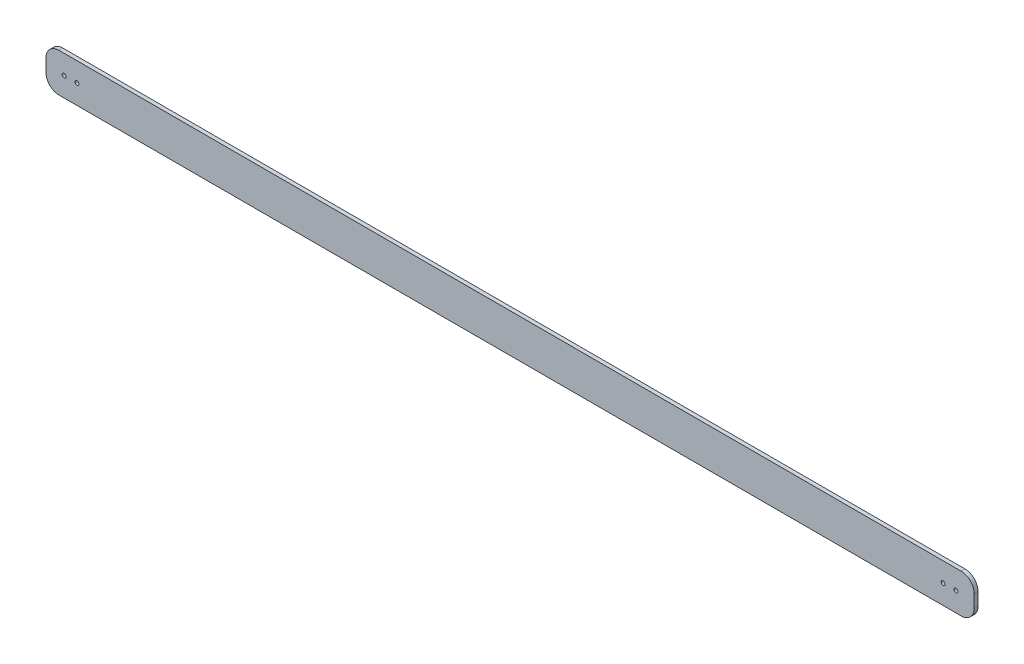
ISO-10303-21;
HEADER;
FILE_DESCRIPTION(('STEP AP214'),'2;1');
FILE_NAME('part.step','',(''),(''),'','','');
FILE_SCHEMA(('AUTOMOTIVE_DESIGN { 1 0 10303 214 1 1 1 1 }'));
ENDSEC;
DATA;
#1=APPLICATION_CONTEXT('core data for automotive mechanical design processes');
#2=APPLICATION_PROTOCOL_DEFINITION('international standard','automotive_design',2000,#1);
#3=PRODUCT_CONTEXT('',#1,'mechanical');
#4=PRODUCT('Part','Part','',(#3));
#5=PRODUCT_RELATED_PRODUCT_CATEGORY('part','',(#4));
#6=PRODUCT_DEFINITION_FORMATION('','',#4);
#7=PRODUCT_DEFINITION_CONTEXT('part definition',#1,'design');
#8=PRODUCT_DEFINITION('design','',#6,#7);
#9=PRODUCT_DEFINITION_SHAPE('','',#8);
#10=(LENGTH_UNIT() NAMED_UNIT(*) SI_UNIT(.MILLI.,.METRE.));
#11=(NAMED_UNIT(*) PLANE_ANGLE_UNIT() SI_UNIT($,.RADIAN.));
#12=(NAMED_UNIT(*) SI_UNIT($,.STERADIAN.) SOLID_ANGLE_UNIT());
#13=UNCERTAINTY_MEASURE_WITH_UNIT(LENGTH_MEASURE(1.E-05),#10,'distance_accuracy_value','');
#14=(GEOMETRIC_REPRESENTATION_CONTEXT(3) GLOBAL_UNCERTAINTY_ASSIGNED_CONTEXT((#13)) GLOBAL_UNIT_ASSIGNED_CONTEXT((#10,
#11,#12)) REPRESENTATION_CONTEXT('',''));
#15=CARTESIAN_POINT('',(0.,0.,0.));
#16=DIRECTION('',(0.,0.,1.));
#17=DIRECTION('',(1.,0.,0.));
#18=AXIS2_PLACEMENT_3D('',#15,#16,#17);
#19=CARTESIAN_POINT('',(401.183077698994,108.864864864865,3.));
#20=DIRECTION('',(0.,0.,1.));
#21=DIRECTION('',(1.,0.,0.));
#22=AXIS2_PLACEMENT_3D('',#19,#20,#21);
#23=PLANE('',#22);
#24=CARTESIAN_POINT('',(387.183077698994,113.864864864865,3.));
#25=DIRECTION('',(0.,0.,1.));
#26=DIRECTION('',(1.,0.,0.));
#27=AXIS2_PLACEMENT_3D('',#24,#25,#26);
#28=CIRCLE('',#27,1.50000000000002);
#29=CARTESIAN_POINT('',(388.683077698994,113.864864864865,3.));
#30=VERTEX_POINT('',#29);
#31=EDGE_CURVE('E190',#30,#30,#28,.T.);
#32=ORIENTED_EDGE('',*,*,#31,.F.);
#33=EDGE_LOOP('',(#32));
#34=FACE_BOUND('',#33,.T.);
#35=CARTESIAN_POINT('',(-292.816922301006,113.864864864865,3.));
#36=DIRECTION('',(0.,0.,1.));
#37=DIRECTION('',(1.,0.,0.));
#38=AXIS2_PLACEMENT_3D('',#35,#36,#37);
#39=CIRCLE('',#38,1.50000000000002);
#40=CARTESIAN_POINT('',(-291.316922301006,113.864864864865,3.));
#41=VERTEX_POINT('',#40);
#42=EDGE_CURVE('E136',#41,#41,#39,.T.);
#43=ORIENTED_EDGE('',*,*,#42,.F.);
#44=EDGE_LOOP('',(#43));
#45=FACE_BOUND('',#44,.T.);
#46=CARTESIAN_POINT('',(401.183077698994,108.864864864865,3.));
#47=DIRECTION('',(0.,0.,1.));
#48=DIRECTION('',(1.,0.,0.));
#49=AXIS2_PLACEMENT_3D('',#46,#47,#48);
#50=CIRCLE('',#49,10.);
#51=CARTESIAN_POINT('',(401.183077698994,98.8648648648649,3.));
#52=VERTEX_POINT('',#51);
#53=CARTESIAN_POINT('',(411.183077698994,108.864864864865,3.));
#54=VERTEX_POINT('',#53);
#55=EDGE_CURVE('E147',#52,#54,#50,.T.);
#56=ORIENTED_EDGE('',*,*,#55,.T.);
#57=DIRECTION('',(0.,1.,0.));
#58=VECTOR('',#57,1.);
#59=CARTESIAN_POINT('',(411.183077698994,118.864864864865,3.));
#60=LINE('',#59,#58);
#61=CARTESIAN_POINT('',(411.183077698994,118.864864864865,3.));
#62=VERTEX_POINT('',#61);
#63=EDGE_CURVE('E95',#54,#62,#60,.T.);
#64=ORIENTED_EDGE('',*,*,#63,.T.);
#65=CARTESIAN_POINT('',(401.183077698994,118.864864864865,3.));
#66=DIRECTION('',(0.,0.,1.));
#67=DIRECTION('',(-1.,0.,0.));
#68=AXIS2_PLACEMENT_3D('',#65,#66,#67);
#69=CIRCLE('',#68,9.99999999999997);
#70=CARTESIAN_POINT('',(401.183077698994,128.864864864865,3.));
#71=VERTEX_POINT('',#70);
#72=EDGE_CURVE('E162',#62,#71,#69,.T.);
#73=ORIENTED_EDGE('',*,*,#72,.T.);
#74=DIRECTION('',(-1.,0.,0.));
#75=VECTOR('',#74,1.);
#76=CARTESIAN_POINT('',(-296.816922301006,128.864864864865,3.));
#77=LINE('',#76,#75);
#78=CARTESIAN_POINT('',(-296.816922301006,128.864864864865,3.));
#79=VERTEX_POINT('',#78);
#80=EDGE_CURVE('E175',#71,#79,#77,.T.);
#81=ORIENTED_EDGE('',*,*,#80,.T.);
#82=CARTESIAN_POINT('',(-296.816922301006,118.864864864865,3.));
#83=DIRECTION('',(0.,0.,1.));
#84=DIRECTION('',(1.,0.,0.));
#85=AXIS2_PLACEMENT_3D('',#82,#83,#84);
#86=CIRCLE('',#85,10.);
#87=CARTESIAN_POINT('',(-306.816922301006,118.864864864865,3.));
#88=VERTEX_POINT('',#87);
#89=EDGE_CURVE('E114',#79,#88,#86,.T.);
#90=ORIENTED_EDGE('',*,*,#89,.T.);
#91=DIRECTION('',(0.,-1.,0.));
#92=VECTOR('',#91,1.);
#93=CARTESIAN_POINT('',(-306.816922301006,118.864864864865,3.));
#94=LINE('',#93,#92);
#95=CARTESIAN_POINT('',(-306.816922301006,108.864864864865,3.));
#96=VERTEX_POINT('',#95);
#97=EDGE_CURVE('E108',#88,#96,#94,.T.);
#98=ORIENTED_EDGE('',*,*,#97,.T.);
#99=CARTESIAN_POINT('',(-296.816922301006,108.864864864865,3.));
#100=DIRECTION('',(0.,0.,1.));
#101=DIRECTION('',(1.,0.,0.));
#102=AXIS2_PLACEMENT_3D('',#99,#100,#101);
#103=CIRCLE('',#102,10.);
#104=CARTESIAN_POINT('',(-296.816922301006,98.8648648648649,3.));
#105=VERTEX_POINT('',#104);
#106=EDGE_CURVE('E112',#96,#105,#103,.T.);
#107=ORIENTED_EDGE('',*,*,#106,.T.);
#108=DIRECTION('',(1.,0.,0.));
#109=VECTOR('',#108,1.);
#110=CARTESIAN_POINT('',(-296.816922301006,98.8648648648649,3.));
#111=LINE('',#110,#109);
#112=EDGE_CURVE('E52',#105,#52,#111,.T.);
#113=ORIENTED_EDGE('',*,*,#112,.T.);
#114=EDGE_LOOP('',(#56,#64,#73,#81,#90,#98,#107,#113));
#115=FACE_BOUND('',#114,.T.);
#116=CARTESIAN_POINT('',(-282.816922301006,113.864864864865,3.));
#117=DIRECTION('',(0.,0.,1.));
#118=DIRECTION('',(1.,0.,0.));
#119=AXIS2_PLACEMENT_3D('',#116,#117,#118);
#120=CIRCLE('',#119,1.50000000000002);
#121=CARTESIAN_POINT('',(-281.316922301006,113.864864864865,3.));
#122=VERTEX_POINT('',#121);
#123=EDGE_CURVE('E184',#122,#122,#120,.T.);
#124=ORIENTED_EDGE('',*,*,#123,.F.);
#125=EDGE_LOOP('',(#124));
#126=FACE_BOUND('',#125,.T.);
#127=CARTESIAN_POINT('',(397.183077698994,113.864864864865,3.));
#128=DIRECTION('',(0.,0.,1.));
#129=DIRECTION('',(1.,0.,0.));
#130=AXIS2_PLACEMENT_3D('',#127,#128,#129);
#131=CIRCLE('',#130,1.50000000000002);
#132=CARTESIAN_POINT('',(398.683077698994,113.864864864865,3.));
#133=VERTEX_POINT('',#132);
#134=EDGE_CURVE('E196',#133,#133,#131,.T.);
#135=ORIENTED_EDGE('',*,*,#134,.F.);
#136=EDGE_LOOP('',(#135));
#137=FACE_BOUND('',#136,.T.);
#138=ADVANCED_FACE('F35',(#34,#45,#115,#126,#137),#23,.T.);
#139=CARTESIAN_POINT('',(401.183077698994,108.864864864865,0.));
#140=DIRECTION('',(0.,0.,1.));
#141=DIRECTION('',(1.,0.,0.));
#142=AXIS2_PLACEMENT_3D('',#139,#140,#141);
#143=PLANE('',#142);
#144=CARTESIAN_POINT('',(401.183077698994,108.864864864865,0.));
#145=DIRECTION('',(0.,0.,1.));
#146=DIRECTION('',(1.,0.,0.));
#147=AXIS2_PLACEMENT_3D('',#144,#145,#146);
#148=CIRCLE('',#147,10.);
#149=CARTESIAN_POINT('',(401.183077698994,98.8648648648649,0.));
#150=VERTEX_POINT('',#149);
#151=CARTESIAN_POINT('',(411.183077698994,108.864864864865,0.));
#152=VERTEX_POINT('',#151);
#153=EDGE_CURVE('E132',#150,#152,#148,.T.);
#154=ORIENTED_EDGE('',*,*,#153,.F.);
#155=DIRECTION('',(1.,0.,0.));
#156=VECTOR('',#155,1.);
#157=CARTESIAN_POINT('',(-296.816922301006,98.8648648648649,0.));
#158=LINE('',#157,#156);
#159=CARTESIAN_POINT('',(-296.816922301006,98.8648648648649,0.));
#160=VERTEX_POINT('',#159);
#161=EDGE_CURVE('E87',#160,#150,#158,.T.);
#162=ORIENTED_EDGE('',*,*,#161,.F.);
#163=CARTESIAN_POINT('',(-296.816922301006,108.864864864865,0.));
#164=DIRECTION('',(0.,0.,1.));
#165=DIRECTION('',(1.,0.,0.));
#166=AXIS2_PLACEMENT_3D('',#163,#164,#165);
#167=CIRCLE('',#166,10.);
#168=CARTESIAN_POINT('',(-306.816922301006,108.864864864865,0.));
#169=VERTEX_POINT('',#168);
#170=EDGE_CURVE('E81',#169,#160,#167,.T.);
#171=ORIENTED_EDGE('',*,*,#170,.F.);
#172=DIRECTION('',(0.,-1.,0.));
#173=VECTOR('',#172,1.);
#174=CARTESIAN_POINT('',(-306.816922301006,118.864864864865,0.));
#175=LINE('',#174,#173);
#176=CARTESIAN_POINT('',(-306.816922301006,118.864864864865,0.));
#177=VERTEX_POINT('',#176);
#178=EDGE_CURVE('E122',#177,#169,#175,.T.);
#179=ORIENTED_EDGE('',*,*,#178,.F.);
#180=CARTESIAN_POINT('',(-296.816922301006,118.864864864865,0.));
#181=DIRECTION('',(0.,0.,1.));
#182=DIRECTION('',(1.,0.,0.));
#183=AXIS2_PLACEMENT_3D('',#180,#181,#182);
#184=CIRCLE('',#183,10.);
#185=CARTESIAN_POINT('',(-296.816922301006,128.864864864865,0.));
#186=VERTEX_POINT('',#185);
#187=EDGE_CURVE('E142',#186,#177,#184,.T.);
#188=ORIENTED_EDGE('',*,*,#187,.F.);
#189=DIRECTION('',(-1.,0.,0.));
#190=VECTOR('',#189,1.);
#191=CARTESIAN_POINT('',(-296.816922301006,128.864864864865,0.));
#192=LINE('',#191,#190);
#193=CARTESIAN_POINT('',(401.183077698994,128.864864864865,0.));
#194=VERTEX_POINT('',#193);
#195=EDGE_CURVE('E140',#194,#186,#192,.T.);
#196=ORIENTED_EDGE('',*,*,#195,.F.);
#197=CARTESIAN_POINT('',(401.183077698994,118.864864864865,0.));
#198=DIRECTION('',(0.,0.,1.));
#199=DIRECTION('',(-1.,0.,0.));
#200=AXIS2_PLACEMENT_3D('',#197,#198,#199);
#201=CIRCLE('',#200,9.99999999999997);
#202=CARTESIAN_POINT('',(411.183077698994,118.864864864865,0.));
#203=VERTEX_POINT('',#202);
#204=EDGE_CURVE('E138',#203,#194,#201,.T.);
#205=ORIENTED_EDGE('',*,*,#204,.F.);
#206=DIRECTION('',(0.,1.,0.));
#207=VECTOR('',#206,1.);
#208=CARTESIAN_POINT('',(411.183077698994,118.864864864865,0.));
#209=LINE('',#208,#207);
#210=EDGE_CURVE('E135',#152,#203,#209,.T.);
#211=ORIENTED_EDGE('',*,*,#210,.F.);
#212=EDGE_LOOP('',(#154,#162,#171,#179,#188,#196,#205,#211));
#213=FACE_BOUND('',#212,.T.);
#214=CARTESIAN_POINT('',(-292.816922301006,113.864864864865,0.));
#215=DIRECTION('',(0.,0.,1.));
#216=DIRECTION('',(1.,0.,0.));
#217=AXIS2_PLACEMENT_3D('',#214,#215,#216);
#218=CIRCLE('',#217,1.50000000000002);
#219=CARTESIAN_POINT('',(-291.316922301006,113.864864864865,0.));
#220=VERTEX_POINT('',#219);
#221=EDGE_CURVE('E181',#220,#220,#218,.T.);
#222=ORIENTED_EDGE('',*,*,#221,.T.);
#223=EDGE_LOOP('',(#222));
#224=FACE_BOUND('',#223,.T.);
#225=CARTESIAN_POINT('',(-282.816922301006,113.864864864865,0.));
#226=DIRECTION('',(0.,0.,1.));
#227=DIRECTION('',(1.,0.,0.));
#228=AXIS2_PLACEMENT_3D('',#225,#226,#227);
#229=CIRCLE('',#228,1.50000000000002);
#230=CARTESIAN_POINT('',(-281.316922301006,113.864864864865,0.));
#231=VERTEX_POINT('',#230);
#232=EDGE_CURVE('E187',#231,#231,#229,.T.);
#233=ORIENTED_EDGE('',*,*,#232,.T.);
#234=EDGE_LOOP('',(#233));
#235=FACE_BOUND('',#234,.T.);
#236=CARTESIAN_POINT('',(387.183077698994,113.864864864865,0.));
#237=DIRECTION('',(0.,0.,1.));
#238=DIRECTION('',(1.,0.,0.));
#239=AXIS2_PLACEMENT_3D('',#236,#237,#238);
#240=CIRCLE('',#239,1.50000000000002);
#241=CARTESIAN_POINT('',(388.683077698994,113.864864864865,0.));
#242=VERTEX_POINT('',#241);
#243=EDGE_CURVE('E193',#242,#242,#240,.T.);
#244=ORIENTED_EDGE('',*,*,#243,.T.);
#245=EDGE_LOOP('',(#244));
#246=FACE_BOUND('',#245,.T.);
#247=CARTESIAN_POINT('',(397.183077698994,113.864864864865,0.));
#248=DIRECTION('',(0.,0.,1.));
#249=DIRECTION('',(1.,0.,0.));
#250=AXIS2_PLACEMENT_3D('',#247,#248,#249);
#251=CIRCLE('',#250,1.50000000000002);
#252=CARTESIAN_POINT('',(398.683077698994,113.864864864865,0.));
#253=VERTEX_POINT('',#252);
#254=EDGE_CURVE('E199',#253,#253,#251,.T.);
#255=ORIENTED_EDGE('',*,*,#254,.T.);
#256=EDGE_LOOP('',(#255));
#257=FACE_BOUND('',#256,.T.);
#258=ADVANCED_FACE('F166',(#213,#224,#235,#246,#257),#143,.F.);
#259=CARTESIAN_POINT('',(401.183077698994,108.864864864865,3.));
#260=DIRECTION('',(0.,0.,-1.));
#261=DIRECTION('',(-1.,0.,0.));
#262=AXIS2_PLACEMENT_3D('',#259,#260,#261);
#263=CYLINDRICAL_SURFACE('',#262,10.);
#264=ORIENTED_EDGE('',*,*,#153,.T.);
#265=DIRECTION('',(0.,0.,-1.));
#266=VECTOR('',#265,1.);
#267=CARTESIAN_POINT('',(411.183077698994,108.864864864865,3.));
#268=LINE('',#267,#266);
#269=EDGE_CURVE('E11',#54,#152,#268,.T.);
#270=ORIENTED_EDGE('',*,*,#269,.F.);
#271=ORIENTED_EDGE('',*,*,#55,.F.);
#272=DIRECTION('',(0.,0.,-1.));
#273=VECTOR('',#272,1.);
#274=CARTESIAN_POINT('',(401.183077698994,98.8648648648649,3.));
#275=LINE('',#274,#273);
#276=EDGE_CURVE('E128',#52,#150,#275,.T.);
#277=ORIENTED_EDGE('',*,*,#276,.T.);
#278=EDGE_LOOP('',(#264,#270,#271,#277));
#279=FACE_BOUND('',#278,.T.);
#280=ADVANCED_FACE('F37',(#279),#263,.T.);
#281=CARTESIAN_POINT('',(411.183077698994,118.864864864865,3.));
#282=DIRECTION('',(-1.,0.,0.));
#283=DIRECTION('',(0.,0.,1.));
#284=AXIS2_PLACEMENT_3D('',#281,#282,#283);
#285=PLANE('',#284);
#286=ORIENTED_EDGE('',*,*,#210,.T.);
#287=DIRECTION('',(0.,0.,-1.));
#288=VECTOR('',#287,1.);
#289=CARTESIAN_POINT('',(411.183077698994,118.864864864865,3.));
#290=LINE('',#289,#288);
#291=EDGE_CURVE('E44',#62,#203,#290,.T.);
#292=ORIENTED_EDGE('',*,*,#291,.F.);
#293=ORIENTED_EDGE('',*,*,#63,.F.);
#294=ORIENTED_EDGE('',*,*,#269,.T.);
#295=EDGE_LOOP('',(#286,#292,#293,#294));
#296=FACE_BOUND('',#295,.T.);
#297=ADVANCED_FACE('F233',(#296),#285,.F.);
#298=CARTESIAN_POINT('',(401.183077698994,118.864864864865,3.));
#299=DIRECTION('',(0.,0.,-1.));
#300=DIRECTION('',(-1.,0.,0.));
#301=AXIS2_PLACEMENT_3D('',#298,#299,#300);
#302=CYLINDRICAL_SURFACE('',#301,9.99999999999997);
#303=ORIENTED_EDGE('',*,*,#204,.T.);
#304=DIRECTION('',(0.,0.,-1.));
#305=VECTOR('',#304,1.);
#306=CARTESIAN_POINT('',(401.183077698994,128.864864864865,3.));
#307=LINE('',#306,#305);
#308=EDGE_CURVE('E154',#71,#194,#307,.T.);
#309=ORIENTED_EDGE('',*,*,#308,.F.);
#310=ORIENTED_EDGE('',*,*,#72,.F.);
#311=ORIENTED_EDGE('',*,*,#291,.T.);
#312=EDGE_LOOP('',(#303,#309,#310,#311));
#313=FACE_BOUND('',#312,.T.);
#314=ADVANCED_FACE('F160',(#313),#302,.T.);
#315=CARTESIAN_POINT('',(-296.816922301006,128.864864864865,3.));
#316=DIRECTION('',(0.,-1.,0.));
#317=DIRECTION('',(0.,0.,-1.));
#318=AXIS2_PLACEMENT_3D('',#315,#316,#317);
#319=PLANE('',#318);
#320=ORIENTED_EDGE('',*,*,#195,.T.);
#321=DIRECTION('',(0.,0.,-1.));
#322=VECTOR('',#321,1.);
#323=CARTESIAN_POINT('',(-296.816922301006,128.864864864865,3.));
#324=LINE('',#323,#322);
#325=EDGE_CURVE('E151',#79,#186,#324,.T.);
#326=ORIENTED_EDGE('',*,*,#325,.F.);
#327=ORIENTED_EDGE('',*,*,#80,.F.);
#328=ORIENTED_EDGE('',*,*,#308,.T.);
#329=EDGE_LOOP('',(#320,#326,#327,#328));
#330=FACE_BOUND('',#329,.T.);
#331=ADVANCED_FACE('F171',(#330),#319,.F.);
#332=CARTESIAN_POINT('',(-296.816922301006,118.864864864865,3.));
#333=DIRECTION('',(0.,0.,-1.));
#334=DIRECTION('',(-1.,0.,0.));
#335=AXIS2_PLACEMENT_3D('',#332,#333,#334);
#336=CYLINDRICAL_SURFACE('',#335,10.);
#337=ORIENTED_EDGE('',*,*,#187,.T.);
#338=DIRECTION('',(0.,0.,-1.));
#339=VECTOR('',#338,1.);
#340=CARTESIAN_POINT('',(-306.816922301006,118.864864864865,3.));
#341=LINE('',#340,#339);
#342=EDGE_CURVE('E123',#88,#177,#341,.T.);
#343=ORIENTED_EDGE('',*,*,#342,.F.);
#344=ORIENTED_EDGE('',*,*,#89,.F.);
#345=ORIENTED_EDGE('',*,*,#325,.T.);
#346=EDGE_LOOP('',(#337,#343,#344,#345));
#347=FACE_BOUND('',#346,.T.);
#348=ADVANCED_FACE('F174',(#347),#336,.T.);
#349=CARTESIAN_POINT('',(-306.816922301006,118.864864864865,3.));
#350=DIRECTION('',(1.,0.,0.));
#351=DIRECTION('',(0.,0.,-1.));
#352=AXIS2_PLACEMENT_3D('',#349,#350,#351);
#353=PLANE('',#352);
#354=ORIENTED_EDGE('',*,*,#178,.T.);
#355=DIRECTION('',(0.,0.,-1.));
#356=VECTOR('',#355,1.);
#357=CARTESIAN_POINT('',(-306.816922301006,108.864864864865,3.));
#358=LINE('',#357,#356);
#359=EDGE_CURVE('E119',#96,#169,#358,.T.);
#360=ORIENTED_EDGE('',*,*,#359,.F.);
#361=ORIENTED_EDGE('',*,*,#97,.F.);
#362=ORIENTED_EDGE('',*,*,#342,.T.);
#363=EDGE_LOOP('',(#354,#360,#361,#362));
#364=FACE_BOUND('',#363,.T.);
#365=ADVANCED_FACE('F120',(#364),#353,.F.);
#366=CARTESIAN_POINT('',(-296.816922301006,108.864864864865,3.));
#367=DIRECTION('',(0.,0.,-1.));
#368=DIRECTION('',(-1.,0.,0.));
#369=AXIS2_PLACEMENT_3D('',#366,#367,#368);
#370=CYLINDRICAL_SURFACE('',#369,10.);
#371=ORIENTED_EDGE('',*,*,#170,.T.);
#372=DIRECTION('',(0.,0.,-1.));
#373=VECTOR('',#372,1.);
#374=CARTESIAN_POINT('',(-296.816922301006,98.8648648648649,3.));
#375=LINE('',#374,#373);
#376=EDGE_CURVE('E124',#105,#160,#375,.T.);
#377=ORIENTED_EDGE('',*,*,#376,.F.);
#378=ORIENTED_EDGE('',*,*,#106,.F.);
#379=ORIENTED_EDGE('',*,*,#359,.T.);
#380=EDGE_LOOP('',(#371,#377,#378,#379));
#381=FACE_BOUND('',#380,.T.);
#382=ADVANCED_FACE('F126',(#381),#370,.T.);
#383=CARTESIAN_POINT('',(-296.816922301006,98.8648648648649,3.));
#384=DIRECTION('',(0.,1.,0.));
#385=DIRECTION('',(0.,0.,1.));
#386=AXIS2_PLACEMENT_3D('',#383,#384,#385);
#387=PLANE('',#386);
#388=ORIENTED_EDGE('',*,*,#161,.T.);
#389=ORIENTED_EDGE('',*,*,#276,.F.);
#390=ORIENTED_EDGE('',*,*,#112,.F.);
#391=ORIENTED_EDGE('',*,*,#376,.T.);
#392=EDGE_LOOP('',(#388,#389,#390,#391));
#393=FACE_BOUND('',#392,.T.);
#394=ADVANCED_FACE('F221',(#393),#387,.F.);
#395=CARTESIAN_POINT('',(-292.816922301006,113.864864864865,3.));
#396=DIRECTION('',(0.,0.,-1.));
#397=DIRECTION('',(-1.,0.,0.));
#398=AXIS2_PLACEMENT_3D('',#395,#396,#397);
#399=CYLINDRICAL_SURFACE('',#398,1.50000000000002);
#400=ORIENTED_EDGE('',*,*,#42,.T.);
#401=EDGE_LOOP('',(#400));
#402=FACE_BOUND('',#401,.T.);
#403=ORIENTED_EDGE('',*,*,#221,.F.);
#404=EDGE_LOOP('',(#403));
#405=FACE_BOUND('',#404,.T.);
#406=ADVANCED_FACE('F218',(#402,#405),#399,.F.);
#407=CARTESIAN_POINT('',(-282.816922301006,113.864864864865,3.));
#408=DIRECTION('',(0.,0.,-1.));
#409=DIRECTION('',(-1.,0.,0.));
#410=AXIS2_PLACEMENT_3D('',#407,#408,#409);
#411=CYLINDRICAL_SURFACE('',#410,1.50000000000002);
#412=ORIENTED_EDGE('',*,*,#123,.T.);
#413=EDGE_LOOP('',(#412));
#414=FACE_BOUND('',#413,.T.);
#415=ORIENTED_EDGE('',*,*,#232,.F.);
#416=EDGE_LOOP('',(#415));
#417=FACE_BOUND('',#416,.T.);
#418=ADVANCED_FACE('F297',(#414,#417),#411,.F.);
#419=CARTESIAN_POINT('',(387.183077698994,113.864864864865,3.));
#420=DIRECTION('',(0.,0.,-1.));
#421=DIRECTION('',(-1.,0.,0.));
#422=AXIS2_PLACEMENT_3D('',#419,#420,#421);
#423=CYLINDRICAL_SURFACE('',#422,1.50000000000002);
#424=ORIENTED_EDGE('',*,*,#31,.T.);
#425=EDGE_LOOP('',(#424));
#426=FACE_BOUND('',#425,.T.);
#427=ORIENTED_EDGE('',*,*,#243,.F.);
#428=EDGE_LOOP('',(#427));
#429=FACE_BOUND('',#428,.T.);
#430=ADVANCED_FACE('F305',(#426,#429),#423,.F.);
#431=CARTESIAN_POINT('',(397.183077698994,113.864864864865,3.));
#432=DIRECTION('',(0.,0.,-1.));
#433=DIRECTION('',(-1.,0.,0.));
#434=AXIS2_PLACEMENT_3D('',#431,#432,#433);
#435=CYLINDRICAL_SURFACE('',#434,1.50000000000002);
#436=ORIENTED_EDGE('',*,*,#134,.T.);
#437=EDGE_LOOP('',(#436));
#438=FACE_BOUND('',#437,.T.);
#439=ORIENTED_EDGE('',*,*,#254,.F.);
#440=EDGE_LOOP('',(#439));
#441=FACE_BOUND('',#440,.T.);
#442=ADVANCED_FACE('F205',(#438,#441),#435,.F.);
#443=CLOSED_SHELL('',(#138,#258,#280,#297,#314,#331,#348,#365,#382,#394,#406,#418,#430,#442));
#444=MANIFOLD_SOLID_BREP('B2',#443);
#445=ADVANCED_BREP_SHAPE_REPRESENTATION('',(#18,#444),#14);
#446=SHAPE_DEFINITION_REPRESENTATION(#9,#445);
ENDSEC;
END-ISO-10303-21;
